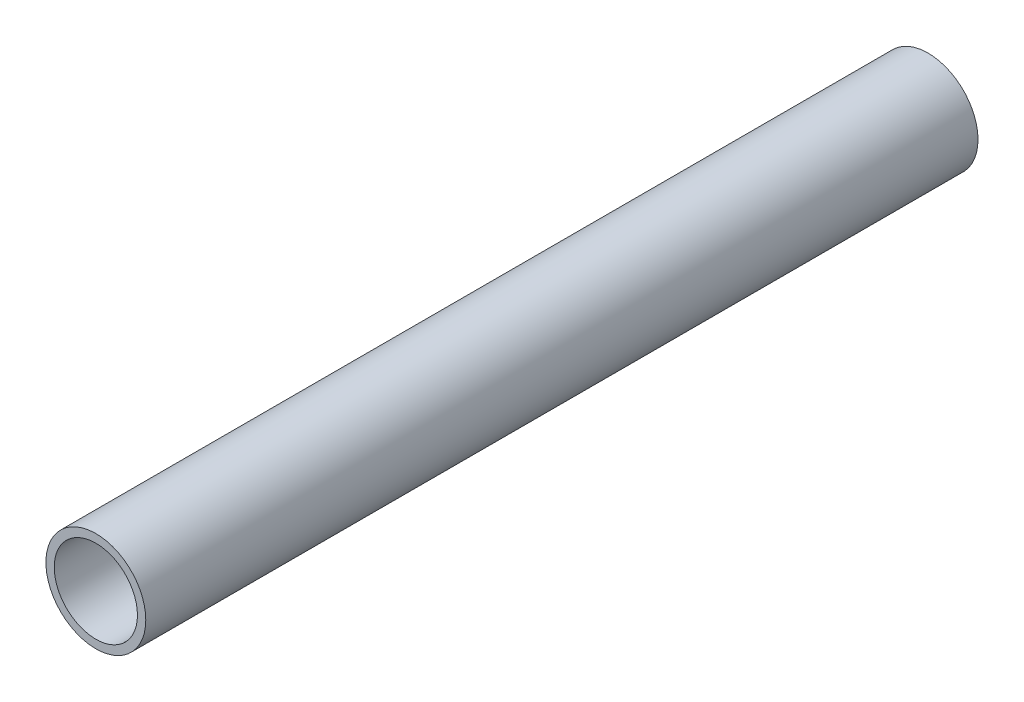
ISO-10303-21;
HEADER;
FILE_DESCRIPTION(('STEP AP214'),'2;1');
FILE_NAME('part.step','',(''),(''),'','','');
FILE_SCHEMA(('AUTOMOTIVE_DESIGN { 1 0 10303 214 1 1 1 1 }'));
ENDSEC;
DATA;
#1=APPLICATION_CONTEXT('core data for automotive mechanical design processes');
#2=APPLICATION_PROTOCOL_DEFINITION('international standard','automotive_design',2000,#1);
#3=PRODUCT_CONTEXT('',#1,'mechanical');
#4=PRODUCT('Part','Part','',(#3));
#5=PRODUCT_RELATED_PRODUCT_CATEGORY('part','',(#4));
#6=PRODUCT_DEFINITION_FORMATION('','',#4);
#7=PRODUCT_DEFINITION_CONTEXT('part definition',#1,'design');
#8=PRODUCT_DEFINITION('design','',#6,#7);
#9=PRODUCT_DEFINITION_SHAPE('','',#8);
#10=(LENGTH_UNIT() NAMED_UNIT(*) SI_UNIT(.MILLI.,.METRE.));
#11=(NAMED_UNIT(*) PLANE_ANGLE_UNIT() SI_UNIT($,.RADIAN.));
#12=(NAMED_UNIT(*) SI_UNIT($,.STERADIAN.) SOLID_ANGLE_UNIT());
#13=UNCERTAINTY_MEASURE_WITH_UNIT(LENGTH_MEASURE(1.E-05),#10,'distance_accuracy_value','');
#14=(GEOMETRIC_REPRESENTATION_CONTEXT(3) GLOBAL_UNCERTAINTY_ASSIGNED_CONTEXT((#13)) GLOBAL_UNIT_ASSIGNED_CONTEXT((#10,
#11,#12)) REPRESENTATION_CONTEXT('',''));
#15=CARTESIAN_POINT('',(0.,0.,0.));
#16=DIRECTION('',(0.,0.,1.));
#17=DIRECTION('',(1.,0.,0.));
#18=AXIS2_PLACEMENT_3D('',#15,#16,#17);
#19=CARTESIAN_POINT('',(0.,0.,-100.));
#20=DIRECTION('',(0.,0.,-1.));
#21=DIRECTION('',(1.,0.,0.));
#22=AXIS2_PLACEMENT_3D('',#19,#20,#21);
#23=PLANE('',#22);
#24=CARTESIAN_POINT('',(0.,0.,-100.));
#25=DIRECTION('',(0.,0.,1.));
#26=DIRECTION('',(1.,0.,0.));
#27=AXIS2_PLACEMENT_3D('',#24,#25,#26);
#28=CIRCLE('',#27,6.);
#29=CARTESIAN_POINT('',(6.,0.,-100.));
#30=VERTEX_POINT('',#29);
#31=EDGE_CURVE('E10',#30,#30,#28,.T.);
#32=ORIENTED_EDGE('',*,*,#31,.F.);
#33=EDGE_LOOP('',(#32));
#34=FACE_BOUND('',#33,.T.);
#35=CARTESIAN_POINT('',(0.,0.,-100.));
#36=DIRECTION('',(0.,0.,1.));
#37=DIRECTION('',(1.,0.,0.));
#38=AXIS2_PLACEMENT_3D('',#35,#36,#37);
#39=CIRCLE('',#38,5.);
#40=CARTESIAN_POINT('',(5.,0.,-100.));
#41=VERTEX_POINT('',#40);
#42=EDGE_CURVE('E52',#41,#41,#39,.T.);
#43=ORIENTED_EDGE('',*,*,#42,.T.);
#44=EDGE_LOOP('',(#43));
#45=FACE_BOUND('',#44,.T.);
#46=ADVANCED_FACE('F41',(#34,#45),#23,.T.);
#47=CARTESIAN_POINT('',(0.,0.,0.));
#48=DIRECTION('',(0.,0.,-1.));
#49=DIRECTION('',(1.,0.,0.));
#50=AXIS2_PLACEMENT_3D('',#47,#48,#49);
#51=PLANE('',#50);
#52=CARTESIAN_POINT('',(0.,0.,0.));
#53=DIRECTION('',(0.,0.,1.));
#54=DIRECTION('',(1.,0.,0.));
#55=AXIS2_PLACEMENT_3D('',#52,#53,#54);
#56=CIRCLE('',#55,6.);
#57=CARTESIAN_POINT('',(6.,0.,0.));
#58=VERTEX_POINT('',#57);
#59=EDGE_CURVE('E45',#58,#58,#56,.T.);
#60=ORIENTED_EDGE('',*,*,#59,.T.);
#61=EDGE_LOOP('',(#60));
#62=FACE_BOUND('',#61,.T.);
#63=CARTESIAN_POINT('',(0.,0.,0.));
#64=DIRECTION('',(0.,0.,1.));
#65=DIRECTION('',(1.,0.,0.));
#66=AXIS2_PLACEMENT_3D('',#63,#64,#65);
#67=CIRCLE('',#66,5.);
#68=CARTESIAN_POINT('',(5.,0.,0.));
#69=VERTEX_POINT('',#68);
#70=EDGE_CURVE('E54',#69,#69,#67,.T.);
#71=ORIENTED_EDGE('',*,*,#70,.F.);
#72=EDGE_LOOP('',(#71));
#73=FACE_BOUND('',#72,.T.);
#74=ADVANCED_FACE('F67',(#62,#73),#51,.F.);
#75=CARTESIAN_POINT('',(0.,0.,-100.));
#76=DIRECTION('',(0.,0.,1.));
#77=DIRECTION('',(-1.,0.,0.));
#78=AXIS2_PLACEMENT_3D('',#75,#76,#77);
#79=CYLINDRICAL_SURFACE('',#78,6.);
#80=ORIENTED_EDGE('',*,*,#31,.T.);
#81=EDGE_LOOP('',(#80));
#82=FACE_BOUND('',#81,.T.);
#83=ORIENTED_EDGE('',*,*,#59,.F.);
#84=EDGE_LOOP('',(#83));
#85=FACE_BOUND('',#84,.T.);
#86=ADVANCED_FACE('F43',(#82,#85),#79,.T.);
#87=CARTESIAN_POINT('',(0.,0.,-100.));
#88=DIRECTION('',(0.,0.,1.));
#89=DIRECTION('',(-1.,0.,0.));
#90=AXIS2_PLACEMENT_3D('',#87,#88,#89);
#91=CYLINDRICAL_SURFACE('',#90,5.);
#92=ORIENTED_EDGE('',*,*,#42,.F.);
#93=EDGE_LOOP('',(#92));
#94=FACE_BOUND('',#93,.T.);
#95=ORIENTED_EDGE('',*,*,#70,.T.);
#96=EDGE_LOOP('',(#95));
#97=FACE_BOUND('',#96,.T.);
#98=ADVANCED_FACE('F61',(#94,#97),#91,.F.);
#99=CLOSED_SHELL('',(#46,#74,#86,#98));
#100=MANIFOLD_SOLID_BREP('B2',#99);
#101=ADVANCED_BREP_SHAPE_REPRESENTATION('',(#18,#100),#14);
#102=SHAPE_DEFINITION_REPRESENTATION(#9,#101);
ENDSEC;
END-ISO-10303-21;
